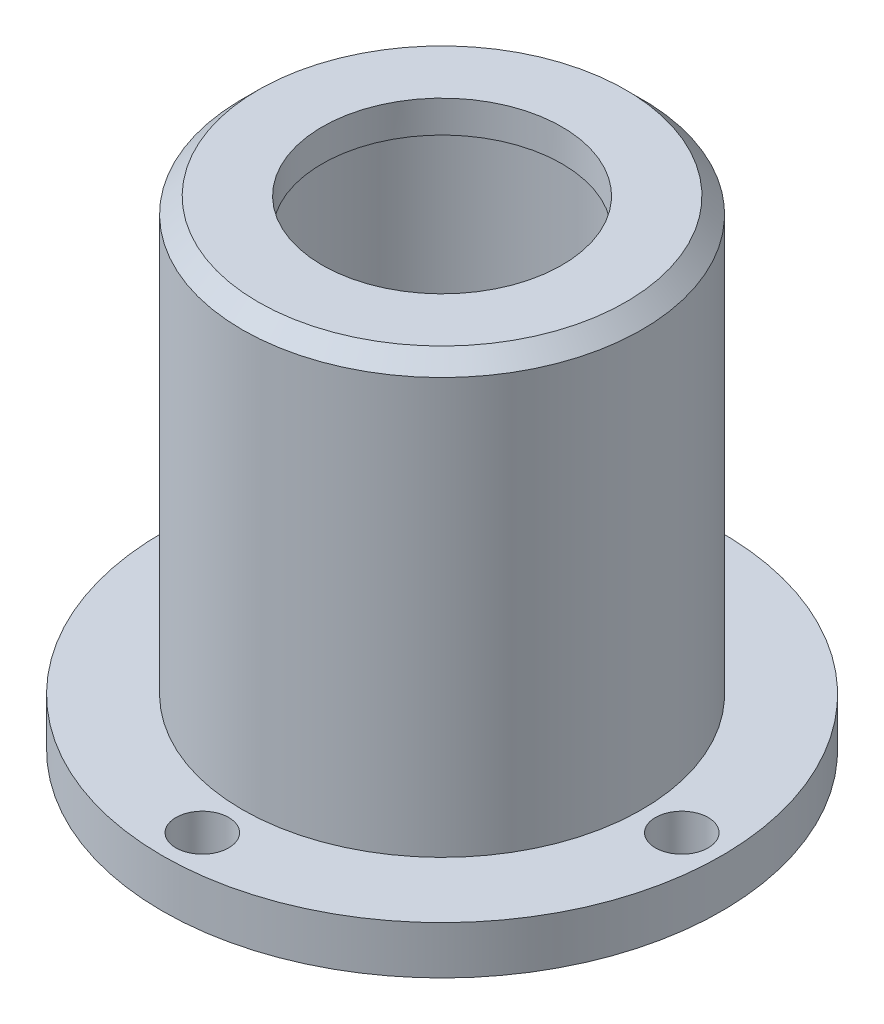
ISO-10303-21;
HEADER;
FILE_DESCRIPTION(('STEP AP214'),'2;1');
FILE_NAME('part.step','',(''),(''),'','','');
FILE_SCHEMA(('AUTOMOTIVE_DESIGN { 1 0 10303 214 1 1 1 1 }'));
ENDSEC;
DATA;
#1=APPLICATION_CONTEXT('core data for automotive mechanical design processes');
#2=APPLICATION_PROTOCOL_DEFINITION('international standard','automotive_design',2000,#1);
#3=PRODUCT_CONTEXT('',#1,'mechanical');
#4=PRODUCT('Part','Part','',(#3));
#5=PRODUCT_RELATED_PRODUCT_CATEGORY('part','',(#4));
#6=PRODUCT_DEFINITION_FORMATION('','',#4);
#7=PRODUCT_DEFINITION_CONTEXT('part definition',#1,'design');
#8=PRODUCT_DEFINITION('design','',#6,#7);
#9=PRODUCT_DEFINITION_SHAPE('','',#8);
#10=(LENGTH_UNIT() NAMED_UNIT(*) SI_UNIT(.MILLI.,.METRE.));
#11=(NAMED_UNIT(*) PLANE_ANGLE_UNIT() SI_UNIT($,.RADIAN.));
#12=(NAMED_UNIT(*) SI_UNIT($,.STERADIAN.) SOLID_ANGLE_UNIT());
#13=UNCERTAINTY_MEASURE_WITH_UNIT(LENGTH_MEASURE(1.E-05),#10,'distance_accuracy_value','');
#14=(GEOMETRIC_REPRESENTATION_CONTEXT(3) GLOBAL_UNCERTAINTY_ASSIGNED_CONTEXT((#13)) GLOBAL_UNIT_ASSIGNED_CONTEXT((#10,
#11,#12)) REPRESENTATION_CONTEXT('',''));
#15=CARTESIAN_POINT('',(0.,0.,0.));
#16=DIRECTION('',(0.,0.,1.));
#17=DIRECTION('',(1.,0.,0.));
#18=AXIS2_PLACEMENT_3D('',#15,#16,#17);
#19=CARTESIAN_POINT('',(0.,3.,0.));
#20=DIRECTION('',(0.,1.,0.));
#21=DIRECTION('',(0.,0.,1.));
#22=AXIS2_PLACEMENT_3D('',#19,#20,#21);
#23=PLANE('',#22);
#24=CARTESIAN_POINT('',(15.,3.,0.));
#25=DIRECTION('',(0.,1.,0.));
#26=DIRECTION('',(0.,0.,1.));
#27=AXIS2_PLACEMENT_3D('',#24,#25,#26);
#28=CIRCLE('',#27,1.65);
#29=CARTESIAN_POINT('',(15.,3.,1.65));
#30=VERTEX_POINT('',#29);
#31=EDGE_CURVE('E84',#30,#30,#28,.T.);
#32=ORIENTED_EDGE('',*,*,#31,.F.);
#33=EDGE_LOOP('',(#32));
#34=FACE_BOUND('',#33,.T.);
#35=CARTESIAN_POINT('',(0.,3.,-15.));
#36=DIRECTION('',(0.,1.,0.));
#37=DIRECTION('',(0.,0.,1.));
#38=AXIS2_PLACEMENT_3D('',#35,#36,#37);
#39=CIRCLE('',#38,1.65);
#40=CARTESIAN_POINT('',(0.,3.,-13.35));
#41=VERTEX_POINT('',#40);
#42=EDGE_CURVE('E78',#41,#41,#39,.T.);
#43=ORIENTED_EDGE('',*,*,#42,.F.);
#44=EDGE_LOOP('',(#43));
#45=FACE_BOUND('',#44,.T.);
#46=CARTESIAN_POINT('',(-15.,3.,0.));
#47=DIRECTION('',(0.,1.,0.));
#48=DIRECTION('',(0.,0.,1.));
#49=AXIS2_PLACEMENT_3D('',#46,#47,#48);
#50=CIRCLE('',#49,1.65);
#51=CARTESIAN_POINT('',(-15.,3.,1.65));
#52=VERTEX_POINT('',#51);
#53=EDGE_CURVE('E72',#52,#52,#50,.T.);
#54=ORIENTED_EDGE('',*,*,#53,.F.);
#55=EDGE_LOOP('',(#54));
#56=FACE_BOUND('',#55,.T.);
#57=CARTESIAN_POINT('',(0.,3.,15.));
#58=DIRECTION('',(0.,1.,0.));
#59=DIRECTION('',(0.,0.,1.));
#60=AXIS2_PLACEMENT_3D('',#57,#58,#59);
#61=CIRCLE('',#60,1.65);
#62=CARTESIAN_POINT('',(0.,3.,16.65));
#63=VERTEX_POINT('',#62);
#64=EDGE_CURVE('E66',#63,#63,#61,.T.);
#65=ORIENTED_EDGE('',*,*,#64,.F.);
#66=EDGE_LOOP('',(#65));
#67=FACE_BOUND('',#66,.T.);
#68=CARTESIAN_POINT('',(0.,3.,0.));
#69=DIRECTION('',(0.,1.,0.));
#70=DIRECTION('',(0.,0.,1.));
#71=AXIS2_PLACEMENT_3D('',#68,#69,#70);
#72=CIRCLE('',#71,17.5);
#73=CARTESIAN_POINT('',(0.,3.,17.5));
#74=VERTEX_POINT('',#73);
#75=EDGE_CURVE('E42',#74,#74,#72,.T.);
#76=ORIENTED_EDGE('',*,*,#75,.T.);
#77=EDGE_LOOP('',(#76));
#78=FACE_BOUND('',#77,.T.);
#79=CARTESIAN_POINT('',(0.,3.,0.));
#80=DIRECTION('',(0.,1.,0.));
#81=DIRECTION('',(0.,0.,1.));
#82=AXIS2_PLACEMENT_3D('',#79,#80,#81);
#83=CIRCLE('',#82,12.5);
#84=CARTESIAN_POINT('',(0.,3.,12.5));
#85=VERTEX_POINT('',#84);
#86=EDGE_CURVE('E55',#85,#85,#83,.T.);
#87=ORIENTED_EDGE('',*,*,#86,.F.);
#88=EDGE_LOOP('',(#87));
#89=FACE_BOUND('',#88,.T.);
#90=ADVANCED_FACE('F31',(#34,#45,#56,#67,#78,#89),#23,.T.);
#91=CARTESIAN_POINT('',(0.,3.,0.));
#92=DIRECTION('',(0.,-1.,0.));
#93=DIRECTION('',(0.,0.,-1.));
#94=AXIS2_PLACEMENT_3D('',#91,#92,#93);
#95=CYLINDRICAL_SURFACE('',#94,17.5);
#96=ORIENTED_EDGE('',*,*,#75,.F.);
#97=EDGE_LOOP('',(#96));
#98=FACE_BOUND('',#97,.T.);
#99=CARTESIAN_POINT('',(0.,0.,0.));
#100=DIRECTION('',(0.,1.,0.));
#101=DIRECTION('',(0.,0.,1.));
#102=AXIS2_PLACEMENT_3D('',#99,#100,#101);
#103=CIRCLE('',#102,17.5);
#104=CARTESIAN_POINT('',(0.,0.,17.5));
#105=VERTEX_POINT('',#104);
#106=EDGE_CURVE('E46',#105,#105,#103,.T.);
#107=ORIENTED_EDGE('',*,*,#106,.T.);
#108=EDGE_LOOP('',(#107));
#109=FACE_BOUND('',#108,.T.);
#110=ADVANCED_FACE('F97',(#98,#109),#95,.T.);
#111=CARTESIAN_POINT('',(0.,0.,0.));
#112=DIRECTION('',(0.,1.,0.));
#113=DIRECTION('',(0.,0.,1.));
#114=AXIS2_PLACEMENT_3D('',#111,#112,#113);
#115=PLANE('',#114);
#116=CARTESIAN_POINT('',(15.,0.,0.));
#117=DIRECTION('',(0.,-1.,0.));
#118=DIRECTION('',(0.,0.,-1.));
#119=AXIS2_PLACEMENT_3D('',#116,#117,#118);
#120=CIRCLE('',#119,1.65);
#121=CARTESIAN_POINT('',(15.,0.,-1.65));
#122=VERTEX_POINT('',#121);
#123=EDGE_CURVE('E87',#122,#122,#120,.T.);
#124=ORIENTED_EDGE('',*,*,#123,.F.);
#125=EDGE_LOOP('',(#124));
#126=FACE_BOUND('',#125,.T.);
#127=CARTESIAN_POINT('',(0.,0.,-15.));
#128=DIRECTION('',(0.,-1.,0.));
#129=DIRECTION('',(0.,0.,-1.));
#130=AXIS2_PLACEMENT_3D('',#127,#128,#129);
#131=CIRCLE('',#130,1.65);
#132=CARTESIAN_POINT('',(0.,0.,-16.65));
#133=VERTEX_POINT('',#132);
#134=EDGE_CURVE('E81',#133,#133,#131,.T.);
#135=ORIENTED_EDGE('',*,*,#134,.F.);
#136=EDGE_LOOP('',(#135));
#137=FACE_BOUND('',#136,.T.);
#138=CARTESIAN_POINT('',(-15.,0.,0.));
#139=DIRECTION('',(0.,-1.,0.));
#140=DIRECTION('',(0.,0.,-1.));
#141=AXIS2_PLACEMENT_3D('',#138,#139,#140);
#142=CIRCLE('',#141,1.65);
#143=CARTESIAN_POINT('',(-15.,0.,-1.65));
#144=VERTEX_POINT('',#143);
#145=EDGE_CURVE('E75',#144,#144,#142,.T.);
#146=ORIENTED_EDGE('',*,*,#145,.F.);
#147=EDGE_LOOP('',(#146));
#148=FACE_BOUND('',#147,.T.);
#149=CARTESIAN_POINT('',(0.,0.,15.));
#150=DIRECTION('',(0.,-1.,0.));
#151=DIRECTION('',(0.,0.,-1.));
#152=AXIS2_PLACEMENT_3D('',#149,#150,#151);
#153=CIRCLE('',#152,1.65);
#154=CARTESIAN_POINT('',(0.,0.,13.35));
#155=VERTEX_POINT('',#154);
#156=EDGE_CURVE('E69',#155,#155,#153,.T.);
#157=ORIENTED_EDGE('',*,*,#156,.F.);
#158=EDGE_LOOP('',(#157));
#159=FACE_BOUND('',#158,.T.);
#160=CARTESIAN_POINT('',(0.,0.,0.));
#161=DIRECTION('',(0.,-1.,0.));
#162=DIRECTION('',(0.,0.,-1.));
#163=AXIS2_PLACEMENT_3D('',#160,#161,#162);
#164=CIRCLE('',#163,9.5);
#165=CARTESIAN_POINT('',(0.,0.,-9.5));
#166=VERTEX_POINT('',#165);
#167=EDGE_CURVE('E52',#166,#166,#164,.T.);
#168=ORIENTED_EDGE('',*,*,#167,.F.);
#169=EDGE_LOOP('',(#168));
#170=FACE_BOUND('',#169,.T.);
#171=ORIENTED_EDGE('',*,*,#106,.F.);
#172=EDGE_LOOP('',(#171));
#173=FACE_BOUND('',#172,.T.);
#174=ADVANCED_FACE('F93',(#126,#137,#148,#159,#170,#173),#115,.F.);
#175=CARTESIAN_POINT('',(0.,30.,0.));
#176=DIRECTION('',(0.,-1.,0.));
#177=DIRECTION('',(0.,0.,-1.));
#178=AXIS2_PLACEMENT_3D('',#175,#176,#177);
#179=CYLINDRICAL_SURFACE('',#178,12.5);
#180=CARTESIAN_POINT('',(0.,29.,0.));
#181=DIRECTION('',(0.,1.,0.));
#182=DIRECTION('',(0.,0.,1.));
#183=AXIS2_PLACEMENT_3D('',#180,#181,#182);
#184=CIRCLE('',#183,12.5);
#185=CARTESIAN_POINT('',(0.,29.,12.5));
#186=VERTEX_POINT('',#185);
#187=EDGE_CURVE('E10',#186,#186,#184,.F.);
#188=ORIENTED_EDGE('',*,*,#187,.T.);
#189=EDGE_LOOP('',(#188));
#190=FACE_BOUND('',#189,.T.);
#191=ORIENTED_EDGE('',*,*,#86,.T.);
#192=EDGE_LOOP('',(#191));
#193=FACE_BOUND('',#192,.T.);
#194=ADVANCED_FACE('F96',(#190,#193),#179,.T.);
#195=CARTESIAN_POINT('',(0.,30.,0.));
#196=DIRECTION('',(0.,1.,0.));
#197=DIRECTION('',(0.,0.,1.));
#198=AXIS2_PLACEMENT_3D('',#195,#196,#197);
#199=PLANE('',#198);
#200=CARTESIAN_POINT('',(0.,30.,0.));
#201=DIRECTION('',(0.,1.,0.));
#202=DIRECTION('',(0.,0.,1.));
#203=AXIS2_PLACEMENT_3D('',#200,#201,#202);
#204=CIRCLE('',#203,11.5);
#205=CARTESIAN_POINT('',(0.,30.,11.5));
#206=VERTEX_POINT('',#205);
#207=EDGE_CURVE('E38',#206,#206,#204,.T.);
#208=ORIENTED_EDGE('',*,*,#207,.T.);
#209=EDGE_LOOP('',(#208));
#210=FACE_BOUND('',#209,.T.);
#211=CARTESIAN_POINT('',(0.,30.,0.));
#212=DIRECTION('',(0.,1.,0.));
#213=DIRECTION('',(0.,0.,1.));
#214=AXIS2_PLACEMENT_3D('',#211,#212,#213);
#215=CIRCLE('',#214,7.5);
#216=CARTESIAN_POINT('',(0.,30.,7.5));
#217=VERTEX_POINT('',#216);
#218=EDGE_CURVE('E53',#217,#217,#215,.T.);
#219=ORIENTED_EDGE('',*,*,#218,.F.);
#220=EDGE_LOOP('',(#219));
#221=FACE_BOUND('',#220,.T.);
#222=ADVANCED_FACE('F122',(#210,#221),#199,.T.);
#223=CARTESIAN_POINT('',(0.,28.,0.));
#224=DIRECTION('',(0.,-1.,0.));
#225=DIRECTION('',(0.,0.,-1.));
#226=AXIS2_PLACEMENT_3D('',#223,#224,#225);
#227=CYLINDRICAL_SURFACE('',#226,9.5);
#228=CARTESIAN_POINT('',(0.,28.,0.));
#229=DIRECTION('',(0.,-1.,0.));
#230=DIRECTION('',(0.,0.,-1.));
#231=AXIS2_PLACEMENT_3D('',#228,#229,#230);
#232=CIRCLE('',#231,9.5);
#233=CARTESIAN_POINT('',(0.,28.,-9.5));
#234=VERTEX_POINT('',#233);
#235=EDGE_CURVE('E59',#234,#234,#232,.T.);
#236=ORIENTED_EDGE('',*,*,#235,.F.);
#237=EDGE_LOOP('',(#236));
#238=FACE_BOUND('',#237,.T.);
#239=ORIENTED_EDGE('',*,*,#167,.T.);
#240=EDGE_LOOP('',(#239));
#241=FACE_BOUND('',#240,.T.);
#242=ADVANCED_FACE('F125',(#238,#241),#227,.F.);
#243=CARTESIAN_POINT('',(0.,28.,0.));
#244=DIRECTION('',(0.,-1.,0.));
#245=DIRECTION('',(0.,0.,-1.));
#246=AXIS2_PLACEMENT_3D('',#243,#244,#245);
#247=PLANE('',#246);
#248=CARTESIAN_POINT('',(0.,28.,0.));
#249=DIRECTION('',(0.,-1.,0.));
#250=DIRECTION('',(0.,0.,-1.));
#251=AXIS2_PLACEMENT_3D('',#248,#249,#250);
#252=CIRCLE('',#251,7.5);
#253=CARTESIAN_POINT('',(0.,28.,-7.5));
#254=VERTEX_POINT('',#253);
#255=EDGE_CURVE('E49',#254,#254,#252,.T.);
#256=ORIENTED_EDGE('',*,*,#255,.F.);
#257=EDGE_LOOP('',(#256));
#258=FACE_BOUND('',#257,.T.);
#259=ORIENTED_EDGE('',*,*,#235,.T.);
#260=EDGE_LOOP('',(#259));
#261=FACE_BOUND('',#260,.T.);
#262=ADVANCED_FACE('F128',(#258,#261),#247,.T.);
#263=CARTESIAN_POINT('',(0.,2.,0.));
#264=DIRECTION('',(0.,1.,0.));
#265=DIRECTION('',(0.,0.,1.));
#266=AXIS2_PLACEMENT_3D('',#263,#264,#265);
#267=CYLINDRICAL_SURFACE('',#266,7.5);
#268=ORIENTED_EDGE('',*,*,#255,.T.);
#269=EDGE_LOOP('',(#268));
#270=FACE_BOUND('',#269,.T.);
#271=ORIENTED_EDGE('',*,*,#218,.T.);
#272=EDGE_LOOP('',(#271));
#273=FACE_BOUND('',#272,.T.);
#274=ADVANCED_FACE('F132',(#270,#273),#267,.F.);
#275=CARTESIAN_POINT('',(0.,30.,0.));
#276=DIRECTION('',(0.,-1.,0.));
#277=DIRECTION('',(0.,0.,-1.));
#278=AXIS2_PLACEMENT_3D('',#275,#276,#277);
#279=CONICAL_SURFACE('',#278,11.5,0.785398163397445);
#280=ORIENTED_EDGE('',*,*,#187,.F.);
#281=EDGE_LOOP('',(#280));
#282=FACE_BOUND('',#281,.T.);
#283=ORIENTED_EDGE('',*,*,#207,.F.);
#284=EDGE_LOOP('',(#283));
#285=FACE_BOUND('',#284,.T.);
#286=ADVANCED_FACE('F33',(#282,#285),#279,.T.);
#287=CARTESIAN_POINT('',(0.,10.,15.));
#288=DIRECTION('',(0.,-1.,0.));
#289=DIRECTION('',(0.,0.,-1.));
#290=AXIS2_PLACEMENT_3D('',#287,#288,#289);
#291=CYLINDRICAL_SURFACE('',#290,1.65);
#292=ORIENTED_EDGE('',*,*,#64,.T.);
#293=EDGE_LOOP('',(#292));
#294=FACE_BOUND('',#293,.T.);
#295=ORIENTED_EDGE('',*,*,#156,.T.);
#296=EDGE_LOOP('',(#295));
#297=FACE_BOUND('',#296,.T.);
#298=ADVANCED_FACE('F137',(#294,#297),#291,.F.);
#299=CARTESIAN_POINT('',(-15.,10.,0.));
#300=DIRECTION('',(0.,-1.,0.));
#301=DIRECTION('',(0.,0.,-1.));
#302=AXIS2_PLACEMENT_3D('',#299,#300,#301);
#303=CYLINDRICAL_SURFACE('',#302,1.65);
#304=ORIENTED_EDGE('',*,*,#53,.T.);
#305=EDGE_LOOP('',(#304));
#306=FACE_BOUND('',#305,.T.);
#307=ORIENTED_EDGE('',*,*,#145,.T.);
#308=EDGE_LOOP('',(#307));
#309=FACE_BOUND('',#308,.T.);
#310=ADVANCED_FACE('F140',(#306,#309),#303,.F.);
#311=CARTESIAN_POINT('',(0.,10.,-15.));
#312=DIRECTION('',(0.,-1.,0.));
#313=DIRECTION('',(0.,0.,-1.));
#314=AXIS2_PLACEMENT_3D('',#311,#312,#313);
#315=CYLINDRICAL_SURFACE('',#314,1.65);
#316=ORIENTED_EDGE('',*,*,#42,.T.);
#317=EDGE_LOOP('',(#316));
#318=FACE_BOUND('',#317,.T.);
#319=ORIENTED_EDGE('',*,*,#134,.T.);
#320=EDGE_LOOP('',(#319));
#321=FACE_BOUND('',#320,.T.);
#322=ADVANCED_FACE('F144',(#318,#321),#315,.F.);
#323=CARTESIAN_POINT('',(15.,10.,0.));
#324=DIRECTION('',(0.,-1.,0.));
#325=DIRECTION('',(0.,0.,-1.));
#326=AXIS2_PLACEMENT_3D('',#323,#324,#325);
#327=CYLINDRICAL_SURFACE('',#326,1.65);
#328=ORIENTED_EDGE('',*,*,#31,.T.);
#329=EDGE_LOOP('',(#328));
#330=FACE_BOUND('',#329,.T.);
#331=ORIENTED_EDGE('',*,*,#123,.T.);
#332=EDGE_LOOP('',(#331));
#333=FACE_BOUND('',#332,.T.);
#334=ADVANCED_FACE('F91',(#330,#333),#327,.F.);
#335=CLOSED_SHELL('',(#90,#110,#174,#194,#222,#242,#262,#274,#286,#298,#310,#322,#334));
#336=MANIFOLD_SOLID_BREP('B2',#335);
#337=ADVANCED_BREP_SHAPE_REPRESENTATION('',(#18,#336),#14);
#338=SHAPE_DEFINITION_REPRESENTATION(#9,#337);
ENDSEC;
END-ISO-10303-21;
